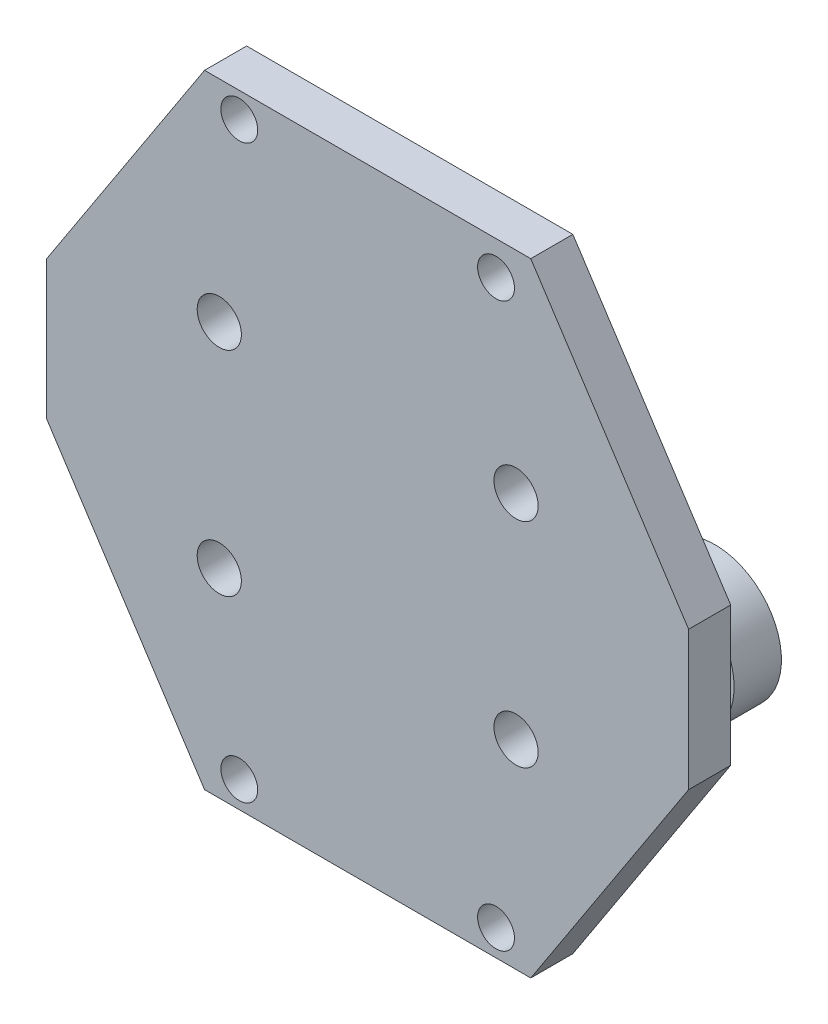
ISO-10303-21;
HEADER;
FILE_DESCRIPTION(('STEP AP214'),'2;1');
FILE_NAME('part.step','',(''),(''),'','','');
FILE_SCHEMA(('AUTOMOTIVE_DESIGN { 1 0 10303 214 1 1 1 1 }'));
ENDSEC;
DATA;
#1=APPLICATION_CONTEXT('core data for automotive mechanical design processes');
#2=APPLICATION_PROTOCOL_DEFINITION('international standard','automotive_design',2000,#1);
#3=PRODUCT_CONTEXT('',#1,'mechanical');
#4=PRODUCT('Part','Part','',(#3));
#5=PRODUCT_RELATED_PRODUCT_CATEGORY('part','',(#4));
#6=PRODUCT_DEFINITION_FORMATION('','',#4);
#7=PRODUCT_DEFINITION_CONTEXT('part definition',#1,'design');
#8=PRODUCT_DEFINITION('design','',#6,#7);
#9=PRODUCT_DEFINITION_SHAPE('','',#8);
#10=(LENGTH_UNIT() NAMED_UNIT(*) SI_UNIT(.MILLI.,.METRE.));
#11=(NAMED_UNIT(*) PLANE_ANGLE_UNIT() SI_UNIT($,.RADIAN.));
#12=(NAMED_UNIT(*) SI_UNIT($,.STERADIAN.) SOLID_ANGLE_UNIT());
#13=UNCERTAINTY_MEASURE_WITH_UNIT(LENGTH_MEASURE(1.E-05),#10,'distance_accuracy_value','');
#14=(GEOMETRIC_REPRESENTATION_CONTEXT(3) GLOBAL_UNCERTAINTY_ASSIGNED_CONTEXT((#13)) GLOBAL_UNIT_ASSIGNED_CONTEXT((#10,
#11,#12)) REPRESENTATION_CONTEXT('',''));
#15=CARTESIAN_POINT('',(0.,0.,0.));
#16=DIRECTION('',(0.,0.,1.));
#17=DIRECTION('',(1.,0.,0.));
#18=AXIS2_PLACEMENT_3D('',#15,#16,#17);
#19=CARTESIAN_POINT('',(0.,0.,0.));
#20=DIRECTION('',(0.,0.,-1.));
#21=DIRECTION('',(-1.,0.,0.));
#22=AXIS2_PLACEMENT_3D('',#19,#20,#21);
#23=PLANE('',#22);
#24=DIRECTION('',(-0.546267780546922,0.837610596838614,0.));
#25=VECTOR('',#24,1.);
#26=CARTESIAN_POINT('',(44.7645888594164,29.1942970822281,0.));
#27=LINE('',#26,#25);
#28=CARTESIAN_POINT('',(41.5,34.2,0.));
#29=VERTEX_POINT('',#28);
#30=CARTESIAN_POINT('',(26.5,57.2,0.));
#31=VERTEX_POINT('',#30);
#32=EDGE_CURVE('E314',#29,#31,#27,.T.);
#33=ORIENTED_EDGE('',*,*,#32,.F.);
#34=DIRECTION('',(0.,1.,0.));
#35=VECTOR('',#34,1.);
#36=CARTESIAN_POINT('',(41.5,-2.,0.));
#37=LINE('',#36,#35);
#38=CARTESIAN_POINT('',(41.5,29.5855477833585,0.));
#39=VERTEX_POINT('',#38);
#40=EDGE_CURVE('E175',#39,#29,#37,.T.);
#41=ORIENTED_EDGE('',*,*,#40,.F.);
#42=CARTESIAN_POINT('',(35.5,27.6,0.));
#43=DIRECTION('',(0.,0.,-1.));
#44=DIRECTION('',(-1.,0.,0.));
#45=AXIS2_PLACEMENT_3D('',#42,#43,#44);
#46=CIRCLE('',#45,6.32);
#47=CARTESIAN_POINT('',(32.0998958320695,32.9274470102688,0.));
#48=VERTEX_POINT('',#47);
#49=EDGE_CURVE('E357',#48,#39,#46,.T.);
#50=ORIENTED_EDGE('',*,*,#49,.F.);
#51=DIRECTION('',(0.,1.,0.));
#52=VECTOR('',#51,1.);
#53=CARTESIAN_POINT('',(32.0998958320695,32.2019017807858,0.));
#54=LINE('',#53,#52);
#55=CARTESIAN_POINT('',(32.0998958320695,22.2725529897312,0.));
#56=VERTEX_POINT('',#55);
#57=EDGE_CURVE('E344',#56,#48,#54,.T.);
#58=ORIENTED_EDGE('',*,*,#57,.F.);
#59=CARTESIAN_POINT('',(41.5,25.6144522166414,0.));
#60=VERTEX_POINT('',#59);
#61=EDGE_CURVE('E276',#60,#56,#46,.T.);
#62=ORIENTED_EDGE('',*,*,#61,.F.);
#63=CARTESIAN_POINT('',(41.5,21.,0.));
#64=VERTEX_POINT('',#63);
#65=EDGE_CURVE('E182',#64,#60,#37,.T.);
#66=ORIENTED_EDGE('',*,*,#65,.F.);
#67=DIRECTION('',(0.546267780546922,0.837610596838614,0.));
#68=VECTOR('',#67,1.);
#69=CARTESIAN_POINT('',(19.5072944297082,-12.7221485411141,0.));
#70=LINE('',#69,#68);
#71=CARTESIAN_POINT('',(26.5,-2.,0.));
#72=VERTEX_POINT('',#71);
#73=EDGE_CURVE('E152',#72,#64,#70,.T.);
#74=ORIENTED_EDGE('',*,*,#73,.F.);
#75=DIRECTION('',(1.,0.,0.));
#76=VECTOR('',#75,1.);
#77=CARTESIAN_POINT('',(17.05,-2.,0.));
#78=LINE('',#77,#76);
#79=CARTESIAN_POINT('',(-4.5,-2.,0.));
#80=VERTEX_POINT('',#79);
#81=EDGE_CURVE('E264',#80,#72,#78,.T.);
#82=ORIENTED_EDGE('',*,*,#81,.F.);
#83=DIRECTION('',(0.546267780546922,-0.837610596838614,0.));
#84=VECTOR('',#83,1.);
#85=CARTESIAN_POINT('',(-4.07228116710875,-2.65583554376658,0.));
#86=LINE('',#85,#84);
#87=CARTESIAN_POINT('',(-19.5,21.,0.));
#88=VERTEX_POINT('',#87);
#89=EDGE_CURVE('E283',#88,#80,#86,.T.);
#90=ORIENTED_EDGE('',*,*,#89,.F.);
#91=DIRECTION('',(0.,-1.,0.));
#92=VECTOR('',#91,1.);
#93=CARTESIAN_POINT('',(-19.5,57.2,0.));
#94=LINE('',#93,#92);
#95=CARTESIAN_POINT('',(-19.5,25.6016962974788,0.));
#96=VERTEX_POINT('',#95);
#97=EDGE_CURVE('E225',#96,#88,#94,.T.);
#98=ORIENTED_EDGE('',*,*,#97,.F.);
#99=CARTESIAN_POINT('',(-13.5,27.6,0.));
#100=DIRECTION('',(0.,0.,-1.));
#101=DIRECTION('',(-1.,0.,0.));
#102=AXIS2_PLACEMENT_3D('',#99,#100,#101);
#103=CIRCLE('',#102,6.32401910872429);
#104=CARTESIAN_POINT('',(-8.83711622985763,23.3279123799186,0.));
#105=VERTEX_POINT('',#104);
#106=EDGE_CURVE('E331',#105,#96,#103,.T.);
#107=ORIENTED_EDGE('',*,*,#106,.F.);
#108=DIRECTION('',(0.,-1.,0.));
#109=VECTOR('',#108,1.);
#110=CARTESIAN_POINT('',(-8.83711622985763,23.3279123799186,0.));
#111=LINE('',#110,#109);
#112=CARTESIAN_POINT('',(-8.83711622985763,31.8720876200814,0.));
#113=VERTEX_POINT('',#112);
#114=EDGE_CURVE('E327',#113,#105,#111,.T.);
#115=ORIENTED_EDGE('',*,*,#114,.F.);
#116=CARTESIAN_POINT('',(-19.5,29.5983037025212,0.));
#117=VERTEX_POINT('',#116);
#118=EDGE_CURVE('E321',#117,#113,#103,.T.);
#119=ORIENTED_EDGE('',*,*,#118,.F.);
#120=CARTESIAN_POINT('',(-19.5,34.2,0.));
#121=VERTEX_POINT('',#120);
#122=EDGE_CURVE('E226',#121,#117,#94,.T.);
#123=ORIENTED_EDGE('',*,*,#122,.F.);
#124=DIRECTION('',(-0.546267780546922,-0.837610596838614,0.));
#125=VECTOR('',#124,1.);
#126=CARTESIAN_POINT('',(-29.329575596817,19.1279840848806,0.));
#127=LINE('',#126,#125);
#128=CARTESIAN_POINT('',(-4.5,57.2,0.));
#129=VERTEX_POINT('',#128);
#130=EDGE_CURVE('E56',#129,#121,#127,.T.);
#131=ORIENTED_EDGE('',*,*,#130,.F.);
#132=DIRECTION('',(-1.,0.,0.));
#133=VECTOR('',#132,1.);
#134=CARTESIAN_POINT('',(4.95,57.2,0.));
#135=LINE('',#134,#133);
#136=EDGE_CURVE('E272',#31,#129,#135,.T.);
#137=ORIENTED_EDGE('',*,*,#136,.F.);
#138=EDGE_LOOP('',(#33,#41,#50,#58,#62,#66,#74,#82,#90,#98,#107,#115,#119,#123,#131,#137));
#139=FACE_BOUND('',#138,.T.);
#140=CARTESIAN_POINT('',(25.0999999999999,16.9252777339742,0.));
#141=DIRECTION('',(0.,0.,-1.));
#142=DIRECTION('',(-1.,0.,0.));
#143=AXIS2_PLACEMENT_3D('',#140,#141,#142);
#144=CIRCLE('',#143,2.1);
#145=CARTESIAN_POINT('',(22.9999999999999,16.9252777339742,0.));
#146=VERTEX_POINT('',#145);
#147=EDGE_CURVE('E194',#146,#146,#144,.T.);
#148=ORIENTED_EDGE('',*,*,#147,.F.);
#149=EDGE_LOOP('',(#148));
#150=FACE_BOUND('',#149,.T.);
#151=CARTESIAN_POINT('',(-3.1,37.1947892741322,0.));
#152=DIRECTION('',(0.,0.,-1.));
#153=DIRECTION('',(-1.,0.,0.));
#154=AXIS2_PLACEMENT_3D('',#151,#152,#153);
#155=CIRCLE('',#154,2.1);
#156=CARTESIAN_POINT('',(-5.2,37.1947892741322,0.));
#157=VERTEX_POINT('',#156);
#158=EDGE_CURVE('E193',#157,#157,#155,.T.);
#159=ORIENTED_EDGE('',*,*,#158,.F.);
#160=EDGE_LOOP('',(#159));
#161=FACE_BOUND('',#160,.T.);
#162=CARTESIAN_POINT('',(-3.10000000000006,16.9252777339742,0.));
#163=DIRECTION('',(0.,0.,-1.));
#164=DIRECTION('',(-1.,0.,0.));
#165=AXIS2_PLACEMENT_3D('',#162,#163,#164);
#166=CIRCLE('',#165,2.1);
#167=CARTESIAN_POINT('',(-5.20000000000006,16.9252777339742,0.));
#168=VERTEX_POINT('',#167);
#169=EDGE_CURVE('E189',#168,#168,#166,.T.);
#170=ORIENTED_EDGE('',*,*,#169,.F.);
#171=EDGE_LOOP('',(#170));
#172=FACE_BOUND('',#171,.T.);
#173=CARTESIAN_POINT('',(25.1,37.1947892741322,0.));
#174=DIRECTION('',(0.,0.,-1.));
#175=DIRECTION('',(-1.,0.,0.));
#176=AXIS2_PLACEMENT_3D('',#173,#174,#175);
#177=CIRCLE('',#176,2.1);
#178=CARTESIAN_POINT('',(23.,37.1947892741322,0.));
#179=VERTEX_POINT('',#178);
#180=EDGE_CURVE('E198',#179,#179,#177,.T.);
#181=ORIENTED_EDGE('',*,*,#180,.F.);
#182=EDGE_LOOP('',(#181));
#183=FACE_BOUND('',#182,.T.);
#184=CARTESIAN_POINT('',(23.2,0.5,0.));
#185=DIRECTION('',(0.,0.,-1.));
#186=DIRECTION('',(-1.,0.,0.));
#187=AXIS2_PLACEMENT_3D('',#184,#185,#186);
#188=CIRCLE('',#187,1.75);
#189=CARTESIAN_POINT('',(21.45,0.5,0.));
#190=VERTEX_POINT('',#189);
#191=EDGE_CURVE('E229',#190,#190,#188,.T.);
#192=ORIENTED_EDGE('',*,*,#191,.F.);
#193=EDGE_LOOP('',(#192));
#194=FACE_BOUND('',#193,.T.);
#195=CARTESIAN_POINT('',(-1.2,0.5,0.));
#196=DIRECTION('',(0.,0.,-1.));
#197=DIRECTION('',(-1.,0.,0.));
#198=AXIS2_PLACEMENT_3D('',#195,#196,#197);
#199=CIRCLE('',#198,1.75);
#200=CARTESIAN_POINT('',(-2.95,0.5,0.));
#201=VERTEX_POINT('',#200);
#202=EDGE_CURVE('E236',#201,#201,#199,.T.);
#203=ORIENTED_EDGE('',*,*,#202,.F.);
#204=EDGE_LOOP('',(#203));
#205=FACE_BOUND('',#204,.T.);
#206=CARTESIAN_POINT('',(-1.2,54.8,0.));
#207=DIRECTION('',(0.,0.,-1.));
#208=DIRECTION('',(-1.,0.,0.));
#209=AXIS2_PLACEMENT_3D('',#206,#207,#208);
#210=CIRCLE('',#209,1.75);
#211=CARTESIAN_POINT('',(-2.95,54.8,0.));
#212=VERTEX_POINT('',#211);
#213=EDGE_CURVE('E231',#212,#212,#210,.T.);
#214=ORIENTED_EDGE('',*,*,#213,.F.);
#215=EDGE_LOOP('',(#214));
#216=FACE_BOUND('',#215,.T.);
#217=CARTESIAN_POINT('',(23.2,54.,0.));
#218=DIRECTION('',(0.,0.,-1.));
#219=DIRECTION('',(-1.,0.,0.));
#220=AXIS2_PLACEMENT_3D('',#217,#218,#219);
#221=CIRCLE('',#220,1.75);
#222=CARTESIAN_POINT('',(21.45,54.,0.));
#223=VERTEX_POINT('',#222);
#224=EDGE_CURVE('E235',#223,#223,#221,.T.);
#225=ORIENTED_EDGE('',*,*,#224,.F.);
#226=EDGE_LOOP('',(#225));
#227=FACE_BOUND('',#226,.T.);
#228=ADVANCED_FACE('F41',(#139,#150,#161,#172,#183,#194,#205,#216,#227),#23,.T.);
#229=CARTESIAN_POINT('',(0.,0.,4.));
#230=DIRECTION('',(0.,0.,-1.));
#231=DIRECTION('',(-1.,0.,0.));
#232=AXIS2_PLACEMENT_3D('',#229,#230,#231);
#233=PLANE('',#232);
#234=CARTESIAN_POINT('',(25.0999999999999,16.9252777339742,4.));
#235=DIRECTION('',(0.,0.,-1.));
#236=DIRECTION('',(-1.,0.,0.));
#237=AXIS2_PLACEMENT_3D('',#234,#235,#236);
#238=CIRCLE('',#237,2.1);
#239=CARTESIAN_POINT('',(22.9999999999999,16.9252777339742,4.));
#240=VERTEX_POINT('',#239);
#241=EDGE_CURVE('E217',#240,#240,#238,.T.);
#242=ORIENTED_EDGE('',*,*,#241,.T.);
#243=EDGE_LOOP('',(#242));
#244=FACE_BOUND('',#243,.T.);
#245=CARTESIAN_POINT('',(-3.1,37.1947892741322,4.));
#246=DIRECTION('',(0.,0.,-1.));
#247=DIRECTION('',(-1.,0.,0.));
#248=AXIS2_PLACEMENT_3D('',#245,#246,#247);
#249=CIRCLE('',#248,2.1);
#250=CARTESIAN_POINT('',(-5.2,37.1947892741322,4.));
#251=VERTEX_POINT('',#250);
#252=EDGE_CURVE('E213',#251,#251,#249,.T.);
#253=ORIENTED_EDGE('',*,*,#252,.T.);
#254=EDGE_LOOP('',(#253));
#255=FACE_BOUND('',#254,.T.);
#256=CARTESIAN_POINT('',(-3.10000000000006,16.9252777339742,4.));
#257=DIRECTION('',(0.,0.,-1.));
#258=DIRECTION('',(-1.,0.,0.));
#259=AXIS2_PLACEMENT_3D('',#256,#257,#258);
#260=CIRCLE('',#259,2.1);
#261=CARTESIAN_POINT('',(-5.20000000000006,16.9252777339742,4.));
#262=VERTEX_POINT('',#261);
#263=EDGE_CURVE('E209',#262,#262,#260,.T.);
#264=ORIENTED_EDGE('',*,*,#263,.T.);
#265=EDGE_LOOP('',(#264));
#266=FACE_BOUND('',#265,.T.);
#267=CARTESIAN_POINT('',(25.1,37.1947892741322,4.));
#268=DIRECTION('',(0.,0.,-1.));
#269=DIRECTION('',(-1.,0.,0.));
#270=AXIS2_PLACEMENT_3D('',#267,#268,#269);
#271=CIRCLE('',#270,2.1);
#272=CARTESIAN_POINT('',(23.,37.1947892741322,4.));
#273=VERTEX_POINT('',#272);
#274=EDGE_CURVE('E205',#273,#273,#271,.T.);
#275=ORIENTED_EDGE('',*,*,#274,.T.);
#276=EDGE_LOOP('',(#275));
#277=FACE_BOUND('',#276,.T.);
#278=CARTESIAN_POINT('',(23.2,0.5,4.));
#279=DIRECTION('',(0.,0.,-1.));
#280=DIRECTION('',(-1.,0.,0.));
#281=AXIS2_PLACEMENT_3D('',#278,#279,#280);
#282=CIRCLE('',#281,1.75);
#283=CARTESIAN_POINT('',(21.45,0.5,4.));
#284=VERTEX_POINT('',#283);
#285=EDGE_CURVE('E258',#284,#284,#282,.T.);
#286=ORIENTED_EDGE('',*,*,#285,.T.);
#287=EDGE_LOOP('',(#286));
#288=FACE_BOUND('',#287,.T.);
#289=CARTESIAN_POINT('',(-1.2,0.5,4.));
#290=DIRECTION('',(0.,0.,-1.));
#291=DIRECTION('',(-1.,0.,0.));
#292=AXIS2_PLACEMENT_3D('',#289,#290,#291);
#293=CIRCLE('',#292,1.75);
#294=CARTESIAN_POINT('',(-2.95,0.5,4.));
#295=VERTEX_POINT('',#294);
#296=EDGE_CURVE('E254',#295,#295,#293,.T.);
#297=ORIENTED_EDGE('',*,*,#296,.T.);
#298=EDGE_LOOP('',(#297));
#299=FACE_BOUND('',#298,.T.);
#300=CARTESIAN_POINT('',(-1.2,54.8,4.));
#301=DIRECTION('',(0.,0.,-1.));
#302=DIRECTION('',(-1.,0.,0.));
#303=AXIS2_PLACEMENT_3D('',#300,#301,#302);
#304=CIRCLE('',#303,1.75);
#305=CARTESIAN_POINT('',(-2.95,54.8,4.));
#306=VERTEX_POINT('',#305);
#307=EDGE_CURVE('E250',#306,#306,#304,.T.);
#308=ORIENTED_EDGE('',*,*,#307,.T.);
#309=EDGE_LOOP('',(#308));
#310=FACE_BOUND('',#309,.T.);
#311=CARTESIAN_POINT('',(23.2,54.,4.));
#312=DIRECTION('',(0.,0.,-1.));
#313=DIRECTION('',(-1.,0.,0.));
#314=AXIS2_PLACEMENT_3D('',#311,#312,#313);
#315=CIRCLE('',#314,1.75);
#316=CARTESIAN_POINT('',(21.45,54.,4.));
#317=VERTEX_POINT('',#316);
#318=EDGE_CURVE('E246',#317,#317,#315,.T.);
#319=ORIENTED_EDGE('',*,*,#318,.T.);
#320=EDGE_LOOP('',(#319));
#321=FACE_BOUND('',#320,.T.);
#322=DIRECTION('',(0.,-1.,0.));
#323=VECTOR('',#322,1.);
#324=CARTESIAN_POINT('',(41.5,57.2,4.));
#325=LINE('',#324,#323);
#326=CARTESIAN_POINT('',(41.5,34.2,4.));
#327=VERTEX_POINT('',#326);
#328=CARTESIAN_POINT('',(41.5,21.,4.));
#329=VERTEX_POINT('',#328);
#330=EDGE_CURVE('E165',#327,#329,#325,.T.);
#331=ORIENTED_EDGE('',*,*,#330,.F.);
#332=DIRECTION('',(0.546267780546922,-0.837610596838614,0.));
#333=VECTOR('',#332,1.);
#334=CARTESIAN_POINT('',(41.5,34.2,4.));
#335=LINE('',#334,#333);
#336=CARTESIAN_POINT('',(26.5,57.2,4.));
#337=VERTEX_POINT('',#336);
#338=EDGE_CURVE('E413',#337,#327,#335,.T.);
#339=ORIENTED_EDGE('',*,*,#338,.F.);
#340=DIRECTION('',(1.,0.,0.));
#341=VECTOR('',#340,1.);
#342=CARTESIAN_POINT('',(0.,57.2,4.));
#343=LINE('',#342,#341);
#344=CARTESIAN_POINT('',(-4.5,57.2,4.));
#345=VERTEX_POINT('',#344);
#346=EDGE_CURVE('E268',#345,#337,#343,.T.);
#347=ORIENTED_EDGE('',*,*,#346,.F.);
#348=DIRECTION('',(0.546267780546922,0.837610596838614,0.));
#349=VECTOR('',#348,1.);
#350=CARTESIAN_POINT('',(-4.5,57.2,4.));
#351=LINE('',#350,#349);
#352=CARTESIAN_POINT('',(-19.5,34.2,4.));
#353=VERTEX_POINT('',#352);
#354=EDGE_CURVE('E289',#353,#345,#351,.T.);
#355=ORIENTED_EDGE('',*,*,#354,.F.);
#356=DIRECTION('',(0.,1.,0.));
#357=VECTOR('',#356,1.);
#358=CARTESIAN_POINT('',(-19.5,-2.,4.));
#359=LINE('',#358,#357);
#360=CARTESIAN_POINT('',(-19.5,21.,4.));
#361=VERTEX_POINT('',#360);
#362=EDGE_CURVE('E221',#361,#353,#359,.T.);
#363=ORIENTED_EDGE('',*,*,#362,.F.);
#364=DIRECTION('',(-0.546267780546922,0.837610596838614,0.));
#365=VECTOR('',#364,1.);
#366=CARTESIAN_POINT('',(-19.5,21.,4.));
#367=LINE('',#366,#365);
#368=CARTESIAN_POINT('',(-4.5,-2.,4.));
#369=VERTEX_POINT('',#368);
#370=EDGE_CURVE('E63',#369,#361,#367,.T.);
#371=ORIENTED_EDGE('',*,*,#370,.F.);
#372=DIRECTION('',(-1.,0.,0.));
#373=VECTOR('',#372,1.);
#374=CARTESIAN_POINT('',(22.,-2.,4.));
#375=LINE('',#374,#373);
#376=CARTESIAN_POINT('',(26.5,-2.,4.));
#377=VERTEX_POINT('',#376);
#378=EDGE_CURVE('E167',#377,#369,#375,.T.);
#379=ORIENTED_EDGE('',*,*,#378,.F.);
#380=DIRECTION('',(-0.546267780546922,-0.837610596838614,0.));
#381=VECTOR('',#380,1.);
#382=CARTESIAN_POINT('',(26.5,-2.,4.));
#383=LINE('',#382,#381);
#384=EDGE_CURVE('E149',#329,#377,#383,.T.);
#385=ORIENTED_EDGE('',*,*,#384,.F.);
#386=EDGE_LOOP('',(#331,#339,#347,#355,#363,#371,#379,#385));
#387=FACE_BOUND('',#386,.T.);
#388=ADVANCED_FACE('F163',(#244,#255,#266,#277,#288,#299,#310,#321,#387),#233,.F.);
#389=CARTESIAN_POINT('',(0.,57.2,0.));
#390=DIRECTION('',(0.,1.,0.));
#391=DIRECTION('',(0.,0.,1.));
#392=AXIS2_PLACEMENT_3D('',#389,#390,#391);
#393=PLANE('',#392);
#394=DIRECTION('',(0.,0.,1.));
#395=VECTOR('',#394,1.);
#396=CARTESIAN_POINT('',(26.5,57.2,-4.));
#397=LINE('',#396,#395);
#398=EDGE_CURVE('E297',#31,#337,#397,.T.);
#399=ORIENTED_EDGE('',*,*,#398,.F.);
#400=ORIENTED_EDGE('',*,*,#136,.T.);
#401=DIRECTION('',(0.,0.,1.));
#402=VECTOR('',#401,1.);
#403=CARTESIAN_POINT('',(-4.5,57.2,-4.));
#404=LINE('',#403,#402);
#405=EDGE_CURVE('E296',#129,#345,#404,.T.);
#406=ORIENTED_EDGE('',*,*,#405,.T.);
#407=ORIENTED_EDGE('',*,*,#346,.T.);
#408=EDGE_LOOP('',(#399,#400,#406,#407));
#409=FACE_BOUND('',#408,.T.);
#410=ADVANCED_FACE('F425',(#409),#393,.T.);
#411=CARTESIAN_POINT('',(0.,-2.,0.));
#412=DIRECTION('',(0.,-1.,0.));
#413=DIRECTION('',(0.,0.,-1.));
#414=AXIS2_PLACEMENT_3D('',#411,#412,#413);
#415=PLANE('',#414);
#416=DIRECTION('',(0.,0.,1.));
#417=VECTOR('',#416,1.);
#418=CARTESIAN_POINT('',(-4.5,-2.,-4.));
#419=LINE('',#418,#417);
#420=EDGE_CURVE('E410',#80,#369,#419,.T.);
#421=ORIENTED_EDGE('',*,*,#420,.F.);
#422=ORIENTED_EDGE('',*,*,#81,.T.);
#423=DIRECTION('',(0.,0.,1.));
#424=VECTOR('',#423,1.);
#425=CARTESIAN_POINT('',(26.5,-2.,-4.));
#426=LINE('',#425,#424);
#427=EDGE_CURVE('E169',#72,#377,#426,.T.);
#428=ORIENTED_EDGE('',*,*,#427,.T.);
#429=ORIENTED_EDGE('',*,*,#378,.T.);
#430=EDGE_LOOP('',(#421,#422,#428,#429));
#431=FACE_BOUND('',#430,.T.);
#432=ADVANCED_FACE('F422',(#431),#415,.T.);
#433=CARTESIAN_POINT('',(23.2,54.,11.5));
#434=DIRECTION('',(0.,0.,-1.));
#435=DIRECTION('',(-1.,0.,0.));
#436=AXIS2_PLACEMENT_3D('',#433,#434,#435);
#437=CYLINDRICAL_SURFACE('',#436,1.75);
#438=ORIENTED_EDGE('',*,*,#224,.T.);
#439=EDGE_LOOP('',(#438));
#440=FACE_BOUND('',#439,.T.);
#441=ORIENTED_EDGE('',*,*,#318,.F.);
#442=EDGE_LOOP('',(#441));
#443=FACE_BOUND('',#442,.T.);
#444=ADVANCED_FACE('F424',(#440,#443),#437,.F.);
#445=CARTESIAN_POINT('',(-1.2,54.8,11.5));
#446=DIRECTION('',(0.,0.,-1.));
#447=DIRECTION('',(-1.,0.,0.));
#448=AXIS2_PLACEMENT_3D('',#445,#446,#447);
#449=CYLINDRICAL_SURFACE('',#448,1.75);
#450=ORIENTED_EDGE('',*,*,#213,.T.);
#451=EDGE_LOOP('',(#450));
#452=FACE_BOUND('',#451,.T.);
#453=ORIENTED_EDGE('',*,*,#307,.F.);
#454=EDGE_LOOP('',(#453));
#455=FACE_BOUND('',#454,.T.);
#456=ADVANCED_FACE('F431',(#452,#455),#449,.F.);
#457=CARTESIAN_POINT('',(-1.2,0.5,11.5));
#458=DIRECTION('',(0.,0.,-1.));
#459=DIRECTION('',(-1.,0.,0.));
#460=AXIS2_PLACEMENT_3D('',#457,#458,#459);
#461=CYLINDRICAL_SURFACE('',#460,1.75);
#462=ORIENTED_EDGE('',*,*,#202,.T.);
#463=EDGE_LOOP('',(#462));
#464=FACE_BOUND('',#463,.T.);
#465=ORIENTED_EDGE('',*,*,#296,.F.);
#466=EDGE_LOOP('',(#465));
#467=FACE_BOUND('',#466,.T.);
#468=ADVANCED_FACE('F461',(#464,#467),#461,.F.);
#469=CARTESIAN_POINT('',(23.2,0.5,11.5));
#470=DIRECTION('',(0.,0.,-1.));
#471=DIRECTION('',(-1.,0.,0.));
#472=AXIS2_PLACEMENT_3D('',#469,#470,#471);
#473=CYLINDRICAL_SURFACE('',#472,1.75);
#474=ORIENTED_EDGE('',*,*,#191,.T.);
#475=EDGE_LOOP('',(#474));
#476=FACE_BOUND('',#475,.T.);
#477=ORIENTED_EDGE('',*,*,#285,.F.);
#478=EDGE_LOOP('',(#477));
#479=FACE_BOUND('',#478,.T.);
#480=ADVANCED_FACE('F467',(#476,#479),#473,.F.);
#481=CARTESIAN_POINT('',(-19.5,0.,0.));
#482=DIRECTION('',(-1.,0.,0.));
#483=DIRECTION('',(0.,0.,1.));
#484=AXIS2_PLACEMENT_3D('',#481,#482,#483);
#485=PLANE('',#484);
#486=DIRECTION('',(0.,0.,-1.));
#487=VECTOR('',#486,1.);
#488=CARTESIAN_POINT('',(-19.5,21.,0.));
#489=LINE('',#488,#487);
#490=EDGE_CURVE('E11',#361,#88,#489,.T.);
#491=ORIENTED_EDGE('',*,*,#490,.F.);
#492=ORIENTED_EDGE('',*,*,#362,.T.);
#493=DIRECTION('',(0.,0.,1.));
#494=VECTOR('',#493,1.);
#495=CARTESIAN_POINT('',(-19.5,34.2,0.));
#496=LINE('',#495,#494);
#497=EDGE_CURVE('E49',#121,#353,#496,.T.);
#498=ORIENTED_EDGE('',*,*,#497,.F.);
#499=ORIENTED_EDGE('',*,*,#122,.T.);
#500=EDGE_CURVE('E230',#117,#96,#94,.T.);
#501=ORIENTED_EDGE('',*,*,#500,.T.);
#502=ORIENTED_EDGE('',*,*,#97,.T.);
#503=EDGE_LOOP('',(#491,#492,#498,#499,#501,#502));
#504=FACE_BOUND('',#503,.T.);
#505=ADVANCED_FACE('F299',(#504),#485,.T.);
#506=CARTESIAN_POINT('',(25.1,37.1947892741322,10.));
#507=DIRECTION('',(0.,0.,-1.));
#508=DIRECTION('',(-1.,0.,0.));
#509=AXIS2_PLACEMENT_3D('',#506,#507,#508);
#510=CYLINDRICAL_SURFACE('',#509,2.1);
#511=ORIENTED_EDGE('',*,*,#180,.T.);
#512=EDGE_LOOP('',(#511));
#513=FACE_BOUND('',#512,.T.);
#514=ORIENTED_EDGE('',*,*,#274,.F.);
#515=EDGE_LOOP('',(#514));
#516=FACE_BOUND('',#515,.T.);
#517=ADVANCED_FACE('F478',(#513,#516),#510,.F.);
#518=CARTESIAN_POINT('',(-3.10000000000006,16.9252777339742,10.));
#519=DIRECTION('',(0.,0.,-1.));
#520=DIRECTION('',(-1.,0.,0.));
#521=AXIS2_PLACEMENT_3D('',#518,#519,#520);
#522=CYLINDRICAL_SURFACE('',#521,2.1);
#523=ORIENTED_EDGE('',*,*,#169,.T.);
#524=EDGE_LOOP('',(#523));
#525=FACE_BOUND('',#524,.T.);
#526=ORIENTED_EDGE('',*,*,#263,.F.);
#527=EDGE_LOOP('',(#526));
#528=FACE_BOUND('',#527,.T.);
#529=ADVANCED_FACE('F492',(#525,#528),#522,.F.);
#530=CARTESIAN_POINT('',(-3.1,37.1947892741322,10.));
#531=DIRECTION('',(0.,0.,-1.));
#532=DIRECTION('',(-1.,0.,0.));
#533=AXIS2_PLACEMENT_3D('',#530,#531,#532);
#534=CYLINDRICAL_SURFACE('',#533,2.1);
#535=ORIENTED_EDGE('',*,*,#158,.T.);
#536=EDGE_LOOP('',(#535));
#537=FACE_BOUND('',#536,.T.);
#538=ORIENTED_EDGE('',*,*,#252,.F.);
#539=EDGE_LOOP('',(#538));
#540=FACE_BOUND('',#539,.T.);
#541=ADVANCED_FACE('F497',(#537,#540),#534,.F.);
#542=CARTESIAN_POINT('',(25.0999999999999,16.9252777339742,10.));
#543=DIRECTION('',(0.,0.,-1.));
#544=DIRECTION('',(-1.,0.,0.));
#545=AXIS2_PLACEMENT_3D('',#542,#543,#544);
#546=CYLINDRICAL_SURFACE('',#545,2.1);
#547=ORIENTED_EDGE('',*,*,#147,.T.);
#548=EDGE_LOOP('',(#547));
#549=FACE_BOUND('',#548,.T.);
#550=ORIENTED_EDGE('',*,*,#241,.F.);
#551=EDGE_LOOP('',(#550));
#552=FACE_BOUND('',#551,.T.);
#553=ADVANCED_FACE('F504',(#549,#552),#546,.F.);
#554=CARTESIAN_POINT('',(41.5,0.,0.));
#555=DIRECTION('',(1.,0.,0.));
#556=DIRECTION('',(0.,0.,-1.));
#557=AXIS2_PLACEMENT_3D('',#554,#555,#556);
#558=PLANE('',#557);
#559=DIRECTION('',(0.,0.,-1.));
#560=VECTOR('',#559,1.);
#561=CARTESIAN_POINT('',(41.5,34.2,0.));
#562=LINE('',#561,#560);
#563=EDGE_CURVE('E157',#327,#29,#562,.T.);
#564=ORIENTED_EDGE('',*,*,#563,.F.);
#565=ORIENTED_EDGE('',*,*,#330,.T.);
#566=DIRECTION('',(0.,0.,1.));
#567=VECTOR('',#566,1.);
#568=CARTESIAN_POINT('',(41.5,21.,0.));
#569=LINE('',#568,#567);
#570=EDGE_CURVE('E146',#64,#329,#569,.T.);
#571=ORIENTED_EDGE('',*,*,#570,.F.);
#572=ORIENTED_EDGE('',*,*,#65,.T.);
#573=EDGE_CURVE('E180',#60,#39,#37,.T.);
#574=ORIENTED_EDGE('',*,*,#573,.T.);
#575=ORIENTED_EDGE('',*,*,#40,.T.);
#576=EDGE_LOOP('',(#564,#565,#571,#572,#574,#575));
#577=FACE_BOUND('',#576,.T.);
#578=ADVANCED_FACE('F172',(#577),#558,.T.);
#579=CARTESIAN_POINT('',(32.0998958320695,32.2019017807858,-4.5));
#580=DIRECTION('',(1.,0.,0.));
#581=DIRECTION('',(0.,0.,-1.));
#582=AXIS2_PLACEMENT_3D('',#579,#580,#581);
#583=PLANE('',#582);
#584=DIRECTION('',(0.,1.,0.));
#585=VECTOR('',#584,1.);
#586=CARTESIAN_POINT('',(32.0998958320695,22.9980982192141,-4.5));
#587=LINE('',#586,#585);
#588=CARTESIAN_POINT('',(32.0998958320696,29.7069626591903,-4.5));
#589=VERTEX_POINT('',#588);
#590=CARTESIAN_POINT('',(32.0998958320695,32.9274470102688,-4.5));
#591=VERTEX_POINT('',#590);
#592=EDGE_CURVE('E350',#589,#591,#587,.T.);
#593=ORIENTED_EDGE('',*,*,#592,.F.);
#594=CARTESIAN_POINT('',(32.0998958320695,27.6,-7.5));
#595=DIRECTION('',(1.,0.,0.));
#596=DIRECTION('',(0.,0.,-1.));
#597=AXIS2_PLACEMENT_3D('',#594,#595,#596);
#598=CIRCLE('',#597,3.66596394516121);
#599=CARTESIAN_POINT('',(32.0998958320696,25.4930373408097,-4.5));
#600=VERTEX_POINT('',#599);
#601=EDGE_CURVE('E282',#589,#600,#598,.T.);
#602=ORIENTED_EDGE('',*,*,#601,.T.);
#603=CARTESIAN_POINT('',(32.0998958320695,22.2725529897312,-4.5));
#604=VERTEX_POINT('',#603);
#605=EDGE_CURVE('E345',#604,#600,#587,.T.);
#606=ORIENTED_EDGE('',*,*,#605,.F.);
#607=DIRECTION('',(0.,0.,1.));
#608=VECTOR('',#607,1.);
#609=CARTESIAN_POINT('',(32.0998958320695,22.2725529897312,-4.5));
#610=LINE('',#609,#608);
#611=EDGE_CURVE('E184',#604,#56,#610,.T.);
#612=ORIENTED_EDGE('',*,*,#611,.T.);
#613=ORIENTED_EDGE('',*,*,#57,.T.);
#614=DIRECTION('',(0.,0.,1.));
#615=VECTOR('',#614,1.);
#616=CARTESIAN_POINT('',(32.0998958320695,32.9274470102688,-4.5));
#617=LINE('',#616,#615);
#618=EDGE_CURVE('E176',#591,#48,#617,.T.);
#619=ORIENTED_EDGE('',*,*,#618,.F.);
#620=EDGE_LOOP('',(#593,#602,#606,#612,#613,#619));
#621=FACE_BOUND('',#620,.T.);
#622=ADVANCED_FACE('F366',(#621),#583,.F.);
#623=CARTESIAN_POINT('',(35.5,27.6,-4.5));
#624=DIRECTION('',(0.,0.,1.));
#625=DIRECTION('',(1.,0.,0.));
#626=AXIS2_PLACEMENT_3D('',#623,#624,#625);
#627=CYLINDRICAL_SURFACE('',#626,6.32);
#628=ORIENTED_EDGE('',*,*,#49,.T.);
#629=EDGE_CURVE('E356',#39,#60,#46,.T.);
#630=ORIENTED_EDGE('',*,*,#629,.T.);
#631=ORIENTED_EDGE('',*,*,#61,.T.);
#632=ORIENTED_EDGE('',*,*,#611,.F.);
#633=CARTESIAN_POINT('',(35.5,27.6,-4.5));
#634=DIRECTION('',(0.,0.,-1.));
#635=DIRECTION('',(-1.,0.,0.));
#636=AXIS2_PLACEMENT_3D('',#633,#634,#635);
#637=CIRCLE('',#636,6.32);
#638=EDGE_CURVE('E349',#591,#604,#637,.T.);
#639=ORIENTED_EDGE('',*,*,#638,.F.);
#640=ORIENTED_EDGE('',*,*,#618,.T.);
#641=EDGE_LOOP('',(#628,#630,#631,#632,#639,#640));
#642=FACE_BOUND('',#641,.T.);
#643=ADVANCED_FACE('F371',(#642),#627,.T.);
#644=CARTESIAN_POINT('',(35.5,27.6,-4.5));
#645=DIRECTION('',(0.,0.,-1.));
#646=DIRECTION('',(-1.,0.,0.));
#647=AXIS2_PLACEMENT_3D('',#644,#645,#646);
#648=PLANE('',#647);
#649=CARTESIAN_POINT('',(35.5,27.6,-4.5));
#650=DIRECTION('',(0.,0.,-1.));
#651=DIRECTION('',(-1.,0.,0.));
#652=AXIS2_PLACEMENT_3D('',#649,#650,#651);
#653=CIRCLE('',#652,4.);
#654=EDGE_CURVE('E158',#589,#600,#653,.T.);
#655=ORIENTED_EDGE('',*,*,#654,.F.);
#656=ORIENTED_EDGE('',*,*,#592,.T.);
#657=ORIENTED_EDGE('',*,*,#638,.T.);
#658=ORIENTED_EDGE('',*,*,#605,.T.);
#659=EDGE_LOOP('',(#655,#656,#657,#658));
#660=FACE_BOUND('',#659,.T.);
#661=ADVANCED_FACE('F515',(#660),#648,.T.);
#662=CARTESIAN_POINT('',(35.5,27.6,0.));
#663=DIRECTION('',(0.,0.,-1.));
#664=DIRECTION('',(-1.,0.,0.));
#665=AXIS2_PLACEMENT_3D('',#662,#663,#664);
#666=PLANE('',#665);
#667=ORIENTED_EDGE('',*,*,#573,.F.);
#668=ORIENTED_EDGE('',*,*,#629,.F.);
#669=EDGE_LOOP('',(#667,#668));
#670=FACE_BOUND('',#669,.T.);
#671=ADVANCED_FACE('F400',(#670),#666,.F.);
#672=CARTESIAN_POINT('',(-13.5,27.6,-4.5));
#673=DIRECTION('',(0.,0.,1.));
#674=DIRECTION('',(1.,0.,0.));
#675=AXIS2_PLACEMENT_3D('',#672,#673,#674);
#676=CYLINDRICAL_SURFACE('',#675,6.32401910872429);
#677=ORIENTED_EDGE('',*,*,#106,.T.);
#678=EDGE_CURVE('E334',#96,#117,#103,.T.);
#679=ORIENTED_EDGE('',*,*,#678,.T.);
#680=ORIENTED_EDGE('',*,*,#118,.T.);
#681=DIRECTION('',(0.,0.,1.));
#682=VECTOR('',#681,1.);
#683=CARTESIAN_POINT('',(-8.83711622985763,31.8720876200814,-4.5));
#684=LINE('',#683,#682);
#685=CARTESIAN_POINT('',(-8.83711622985763,31.8720876200814,-4.5));
#686=VERTEX_POINT('',#685);
#687=EDGE_CURVE('E340',#686,#113,#684,.T.);
#688=ORIENTED_EDGE('',*,*,#687,.F.);
#689=CARTESIAN_POINT('',(-13.5,27.6,-4.5));
#690=DIRECTION('',(0.,0.,-1.));
#691=DIRECTION('',(-1.,0.,0.));
#692=AXIS2_PLACEMENT_3D('',#689,#690,#691);
#693=CIRCLE('',#692,6.32401910872429);
#694=CARTESIAN_POINT('',(-8.83711622985763,23.3279123799186,-4.5));
#695=VERTEX_POINT('',#694);
#696=EDGE_CURVE('E322',#695,#686,#693,.T.);
#697=ORIENTED_EDGE('',*,*,#696,.F.);
#698=DIRECTION('',(0.,0.,1.));
#699=VECTOR('',#698,1.);
#700=CARTESIAN_POINT('',(-8.83711622985763,23.3279123799186,-4.5));
#701=LINE('',#700,#699);
#702=EDGE_CURVE('E330',#695,#105,#701,.T.);
#703=ORIENTED_EDGE('',*,*,#702,.T.);
#704=EDGE_LOOP('',(#677,#679,#680,#688,#697,#703));
#705=FACE_BOUND('',#704,.T.);
#706=ADVANCED_FACE('F385',(#705),#676,.T.);
#707=CARTESIAN_POINT('',(-8.83711622985763,23.3279123799186,-4.5));
#708=DIRECTION('',(-1.,0.,0.));
#709=DIRECTION('',(0.,0.,1.));
#710=AXIS2_PLACEMENT_3D('',#707,#708,#709);
#711=PLANE('',#710);
#712=ORIENTED_EDGE('',*,*,#114,.T.);
#713=ORIENTED_EDGE('',*,*,#702,.F.);
#714=DIRECTION('',(0.,-1.,0.));
#715=VECTOR('',#714,1.);
#716=CARTESIAN_POINT('',(-8.83711622985763,23.3279123799186,-4.5));
#717=LINE('',#716,#715);
#718=EDGE_CURVE('E326',#686,#695,#717,.T.);
#719=ORIENTED_EDGE('',*,*,#718,.F.);
#720=ORIENTED_EDGE('',*,*,#687,.T.);
#721=EDGE_LOOP('',(#712,#713,#719,#720));
#722=FACE_BOUND('',#721,.T.);
#723=ADVANCED_FACE('F390',(#722),#711,.F.);
#724=CARTESIAN_POINT('',(-13.5,27.6,-4.5));
#725=DIRECTION('',(0.,0.,-1.));
#726=DIRECTION('',(-1.,0.,0.));
#727=AXIS2_PLACEMENT_3D('',#724,#725,#726);
#728=PLANE('',#727);
#729=CARTESIAN_POINT('',(-13.5,27.6,-4.5));
#730=DIRECTION('',(0.,0.,-1.));
#731=DIRECTION('',(-1.,0.,0.));
#732=AXIS2_PLACEMENT_3D('',#729,#730,#731);
#733=CIRCLE('',#732,4.);
#734=CARTESIAN_POINT('',(-17.5,27.6,-4.5));
#735=VERTEX_POINT('',#734);
#736=EDGE_CURVE('E279',#735,#735,#733,.F.);
#737=ORIENTED_EDGE('',*,*,#736,.T.);
#738=EDGE_LOOP('',(#737));
#739=FACE_BOUND('',#738,.T.);
#740=ORIENTED_EDGE('',*,*,#696,.T.);
#741=ORIENTED_EDGE('',*,*,#718,.T.);
#742=EDGE_LOOP('',(#740,#741));
#743=FACE_BOUND('',#742,.T.);
#744=ADVANCED_FACE('F525',(#739,#743),#728,.T.);
#745=CARTESIAN_POINT('',(-13.5,27.6,0.));
#746=DIRECTION('',(0.,0.,-1.));
#747=DIRECTION('',(-1.,0.,0.));
#748=AXIS2_PLACEMENT_3D('',#745,#746,#747);
#749=PLANE('',#748);
#750=ORIENTED_EDGE('',*,*,#500,.F.);
#751=ORIENTED_EDGE('',*,*,#678,.F.);
#752=EDGE_LOOP('',(#750,#751));
#753=FACE_BOUND('',#752,.T.);
#754=ADVANCED_FACE('F394',(#753),#749,.F.);
#755=CARTESIAN_POINT('',(35.5,27.6,-7.5));
#756=DIRECTION('',(0.,1.,0.));
#757=DIRECTION('',(-1.,0.,0.));
#758=AXIS2_PLACEMENT_3D('',#755,#756,#757);
#759=SPHERICAL_SURFACE('',#758,5.);
#760=ORIENTED_EDGE('',*,*,#654,.T.);
#761=ORIENTED_EDGE('',*,*,#601,.F.);
#762=EDGE_LOOP('',(#760,#761));
#763=FACE_BOUND('',#762,.T.);
#764=ADVANCED_FACE('F528',(#763),#759,.F.);
#765=CARTESIAN_POINT('',(-13.5,27.6,-7.5));
#766=DIRECTION('',(0.,1.,0.));
#767=DIRECTION('',(1.,0.,0.));
#768=AXIS2_PLACEMENT_3D('',#765,#766,#767);
#769=SPHERICAL_SURFACE('',#768,5.);
#770=CARTESIAN_POINT('',(-13.5,27.6,-7.5));
#771=DIRECTION('',(0.,0.,-1.));
#772=DIRECTION('',(-1.,0.,0.));
#773=AXIS2_PLACEMENT_3D('',#770,#771,#772);
#774=SPHERICAL_SURFACE('',#773,5.);
#775=ORIENTED_EDGE('',*,*,#736,.F.);
#776=EDGE_LOOP('',(#775));
#777=FACE_BOUND('',#776,.T.);
#778=ADVANCED_FACE('F534',(#777),#774,.F.);
#779=CARTESIAN_POINT('',(26.5,-2.,-4.));
#780=DIRECTION('',(-0.837610596838614,0.546267780546922,0.));
#781=DIRECTION('',(-0.546267780546922,-0.837610596838614,0.));
#782=AXIS2_PLACEMENT_3D('',#779,#780,#781);
#783=PLANE('',#782);
#784=ORIENTED_EDGE('',*,*,#73,.T.);
#785=ORIENTED_EDGE('',*,*,#570,.T.);
#786=ORIENTED_EDGE('',*,*,#384,.T.);
#787=ORIENTED_EDGE('',*,*,#427,.F.);
#788=EDGE_LOOP('',(#784,#785,#786,#787));
#789=FACE_BOUND('',#788,.T.);
#790=ADVANCED_FACE('F148',(#789),#783,.F.);
#791=CARTESIAN_POINT('',(41.5,34.2,-4.));
#792=DIRECTION('',(-0.837610596838614,-0.546267780546922,0.));
#793=DIRECTION('',(0.546267780546922,-0.837610596838614,0.));
#794=AXIS2_PLACEMENT_3D('',#791,#792,#793);
#795=PLANE('',#794);
#796=ORIENTED_EDGE('',*,*,#32,.T.);
#797=ORIENTED_EDGE('',*,*,#398,.T.);
#798=ORIENTED_EDGE('',*,*,#338,.T.);
#799=ORIENTED_EDGE('',*,*,#563,.T.);
#800=EDGE_LOOP('',(#796,#797,#798,#799));
#801=FACE_BOUND('',#800,.T.);
#802=ADVANCED_FACE('F541',(#801),#795,.F.);
#803=CARTESIAN_POINT('',(-4.5,57.2,-4.));
#804=DIRECTION('',(0.837610596838614,-0.546267780546922,0.));
#805=DIRECTION('',(0.546267780546922,0.837610596838614,0.));
#806=AXIS2_PLACEMENT_3D('',#803,#804,#805);
#807=PLANE('',#806);
#808=ORIENTED_EDGE('',*,*,#130,.T.);
#809=ORIENTED_EDGE('',*,*,#497,.T.);
#810=ORIENTED_EDGE('',*,*,#354,.T.);
#811=ORIENTED_EDGE('',*,*,#405,.F.);
#812=EDGE_LOOP('',(#808,#809,#810,#811));
#813=FACE_BOUND('',#812,.T.);
#814=ADVANCED_FACE('F288',(#813),#807,.F.);
#815=CARTESIAN_POINT('',(-19.5,21.,-4.));
#816=DIRECTION('',(0.837610596838614,0.546267780546922,0.));
#817=DIRECTION('',(-0.546267780546922,0.837610596838614,0.));
#818=AXIS2_PLACEMENT_3D('',#815,#816,#817);
#819=PLANE('',#818);
#820=ORIENTED_EDGE('',*,*,#89,.T.);
#821=ORIENTED_EDGE('',*,*,#420,.T.);
#822=ORIENTED_EDGE('',*,*,#370,.T.);
#823=ORIENTED_EDGE('',*,*,#490,.T.);
#824=EDGE_LOOP('',(#820,#821,#822,#823));
#825=FACE_BOUND('',#824,.T.);
#826=ADVANCED_FACE('F304',(#825),#819,.F.);
#827=CLOSED_SHELL('',(#228,#388,#410,#432,#444,#456,#468,#480,#505,#517,#529,#541,#553,#578,
#622,#643,#661,#671,#706,#723,#744,#754,#764,#778,#790,#802,#814,#826));
#828=MANIFOLD_SOLID_BREP('B2',#827);
#829=ADVANCED_BREP_SHAPE_REPRESENTATION('',(#18,#828),#14);
#830=SHAPE_DEFINITION_REPRESENTATION(#9,#829);
ENDSEC;
END-ISO-10303-21;
